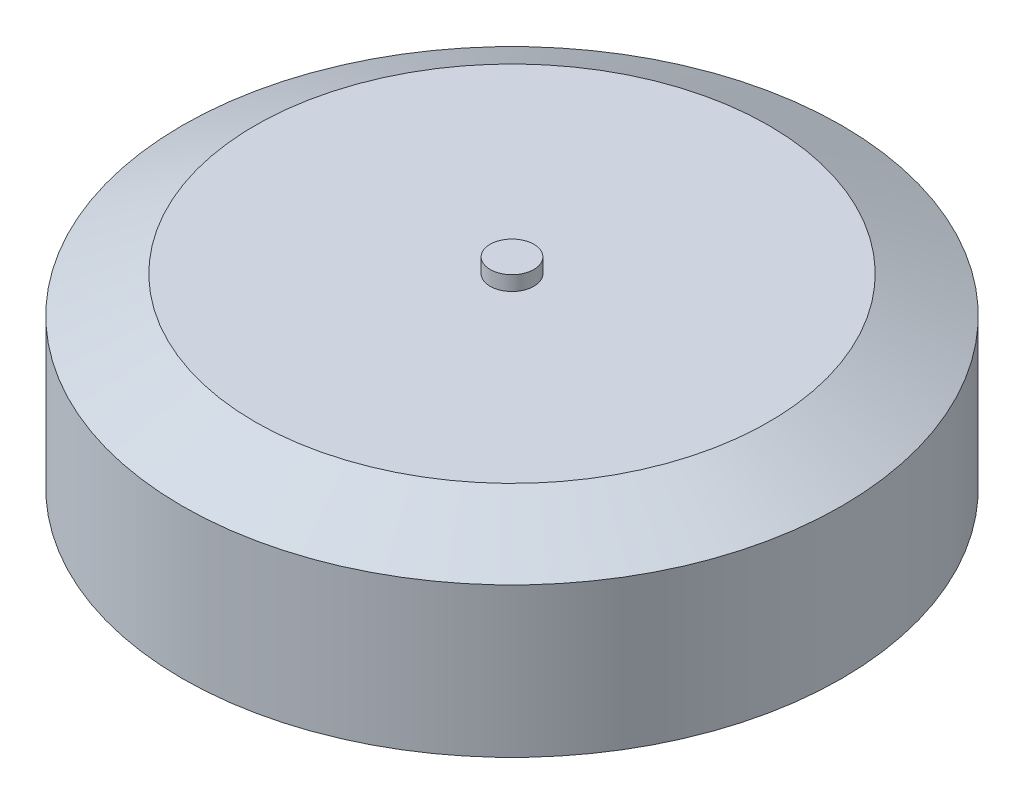
ISO-10303-21;
HEADER;
FILE_DESCRIPTION(('STEP AP214'),'2;1');
FILE_NAME('part.step','',(''),(''),'','','');
FILE_SCHEMA(('AUTOMOTIVE_DESIGN { 1 0 10303 214 1 1 1 1 }'));
ENDSEC;
DATA;
#1=APPLICATION_CONTEXT('core data for automotive mechanical design processes');
#2=APPLICATION_PROTOCOL_DEFINITION('international standard','automotive_design',2000,#1);
#3=PRODUCT_CONTEXT('',#1,'mechanical');
#4=PRODUCT('Part','Part','',(#3));
#5=PRODUCT_RELATED_PRODUCT_CATEGORY('part','',(#4));
#6=PRODUCT_DEFINITION_FORMATION('','',#4);
#7=PRODUCT_DEFINITION_CONTEXT('part definition',#1,'design');
#8=PRODUCT_DEFINITION('design','',#6,#7);
#9=PRODUCT_DEFINITION_SHAPE('','',#8);
#10=(LENGTH_UNIT() NAMED_UNIT(*) SI_UNIT(.MILLI.,.METRE.));
#11=(NAMED_UNIT(*) PLANE_ANGLE_UNIT() SI_UNIT($,.RADIAN.));
#12=(NAMED_UNIT(*) SI_UNIT($,.STERADIAN.) SOLID_ANGLE_UNIT());
#13=UNCERTAINTY_MEASURE_WITH_UNIT(LENGTH_MEASURE(1.E-05),#10,'distance_accuracy_value','');
#14=(GEOMETRIC_REPRESENTATION_CONTEXT(3) GLOBAL_UNCERTAINTY_ASSIGNED_CONTEXT((#13)) GLOBAL_UNIT_ASSIGNED_CONTEXT((#10,
#11,#12)) REPRESENTATION_CONTEXT('',''));
#15=CARTESIAN_POINT('',(0.,0.,0.));
#16=DIRECTION('',(0.,0.,1.));
#17=DIRECTION('',(1.,0.,0.));
#18=AXIS2_PLACEMENT_3D('',#15,#16,#17);
#19=CARTESIAN_POINT('',(0.,15.25,0.));
#20=DIRECTION('',(0.,-1.,0.));
#21=DIRECTION('',(0.,0.,-1.));
#22=AXIS2_PLACEMENT_3D('',#19,#20,#21);
#23=PLANE('',#22);
#24=CARTESIAN_POINT('',(0.,15.25,0.));
#25=DIRECTION('',(0.,-1.,0.));
#26=DIRECTION('',(0.,0.,-1.));
#27=AXIS2_PLACEMENT_3D('',#24,#25,#26);
#28=CIRCLE('',#27,3.);
#29=CARTESIAN_POINT('',(0.,15.25,-3.));
#30=VERTEX_POINT('',#29);
#31=EDGE_CURVE('E10',#30,#30,#28,.F.);
#32=ORIENTED_EDGE('',*,*,#31,.F.);
#33=EDGE_LOOP('',(#32));
#34=FACE_BOUND('',#33,.T.);
#35=CARTESIAN_POINT('',(0.,15.25,0.));
#36=DIRECTION('',(0.,-1.,0.));
#37=DIRECTION('',(0.,0.,-1.));
#38=AXIS2_PLACEMENT_3D('',#35,#36,#37);
#39=CIRCLE('',#38,35.25);
#40=CARTESIAN_POINT('',(0.,15.25,-35.25));
#41=VERTEX_POINT('',#40);
#42=EDGE_CURVE('E43',#41,#41,#39,.T.);
#43=ORIENTED_EDGE('',*,*,#42,.F.);
#44=EDGE_LOOP('',(#43));
#45=FACE_BOUND('',#44,.T.);
#46=ADVANCED_FACE('F37',(#34,#45),#23,.F.);
#47=CARTESIAN_POINT('',(0.,15.25,0.));
#48=DIRECTION('',(0.,-1.,0.));
#49=DIRECTION('',(0.,0.,-1.));
#50=AXIS2_PLACEMENT_3D('',#47,#48,#49);
#51=CONICAL_SURFACE('',#50,35.25,1.10714871779409);
#52=CARTESIAN_POINT('',(0.,10.25,0.));
#53=DIRECTION('',(0.,-1.,0.));
#54=DIRECTION('',(0.,0.,-1.));
#55=AXIS2_PLACEMENT_3D('',#52,#53,#54);
#56=CIRCLE('',#55,45.25);
#57=CARTESIAN_POINT('',(0.,10.25,-45.25));
#58=VERTEX_POINT('',#57);
#59=EDGE_CURVE('E47',#58,#58,#56,.T.);
#60=ORIENTED_EDGE('',*,*,#59,.F.);
#61=EDGE_LOOP('',(#60));
#62=FACE_BOUND('',#61,.T.);
#63=ORIENTED_EDGE('',*,*,#42,.T.);
#64=EDGE_LOOP('',(#63));
#65=FACE_BOUND('',#64,.T.);
#66=ADVANCED_FACE('F78',(#62,#65),#51,.T.);
#67=CARTESIAN_POINT('',(0.,-78.3816339571213,0.));
#68=DIRECTION('',(0.,-1.,0.));
#69=DIRECTION('',(0.,0.,-1.));
#70=AXIS2_PLACEMENT_3D('',#67,#68,#69);
#71=CYLINDRICAL_SURFACE('',#70,45.25);
#72=CARTESIAN_POINT('',(0.,-10.25,0.));
#73=DIRECTION('',(0.,-1.,0.));
#74=DIRECTION('',(0.,0.,-1.));
#75=AXIS2_PLACEMENT_3D('',#72,#73,#74);
#76=CIRCLE('',#75,45.25);
#77=CARTESIAN_POINT('',(0.,-10.25,-45.25));
#78=VERTEX_POINT('',#77);
#79=EDGE_CURVE('E51',#78,#78,#76,.T.);
#80=ORIENTED_EDGE('',*,*,#79,.F.);
#81=EDGE_LOOP('',(#80));
#82=FACE_BOUND('',#81,.T.);
#83=ORIENTED_EDGE('',*,*,#59,.T.);
#84=EDGE_LOOP('',(#83));
#85=FACE_BOUND('',#84,.T.);
#86=ADVANCED_FACE('F83',(#82,#85),#71,.T.);
#87=CARTESIAN_POINT('',(0.,-10.25,0.));
#88=DIRECTION('',(0.,1.,0.));
#89=DIRECTION('',(0.,0.,1.));
#90=AXIS2_PLACEMENT_3D('',#87,#88,#89);
#91=CONICAL_SURFACE('',#90,45.25,1.10714871779409);
#92=CARTESIAN_POINT('',(0.,-15.25,0.));
#93=DIRECTION('',(0.,-1.,0.));
#94=DIRECTION('',(0.,0.,-1.));
#95=AXIS2_PLACEMENT_3D('',#92,#93,#94);
#96=CIRCLE('',#95,35.25);
#97=CARTESIAN_POINT('',(0.,-15.25,-35.25));
#98=VERTEX_POINT('',#97);
#99=EDGE_CURVE('E56',#98,#98,#96,.T.);
#100=ORIENTED_EDGE('',*,*,#99,.F.);
#101=EDGE_LOOP('',(#100));
#102=FACE_BOUND('',#101,.T.);
#103=ORIENTED_EDGE('',*,*,#79,.T.);
#104=EDGE_LOOP('',(#103));
#105=FACE_BOUND('',#104,.T.);
#106=ADVANCED_FACE('F75',(#102,#105),#91,.T.);
#107=CARTESIAN_POINT('',(-35.25,-15.25,0.));
#108=DIRECTION('',(0.,1.,0.));
#109=DIRECTION('',(0.,0.,1.));
#110=AXIS2_PLACEMENT_3D('',#107,#108,#109);
#111=PLANE('',#110);
#112=ORIENTED_EDGE('',*,*,#99,.T.);
#113=EDGE_LOOP('',(#112));
#114=FACE_BOUND('',#113,.T.);
#115=ADVANCED_FACE('F67',(#114),#111,.F.);
#116=CARTESIAN_POINT('',(0.,17.25,0.));
#117=DIRECTION('',(0.,-1.,0.));
#118=DIRECTION('',(0.,0.,-1.));
#119=AXIS2_PLACEMENT_3D('',#116,#117,#118);
#120=CYLINDRICAL_SURFACE('',#119,3.);
#121=CARTESIAN_POINT('',(0.,17.25,0.));
#122=DIRECTION('',(0.,1.,0.));
#123=DIRECTION('',(0.,0.,1.));
#124=AXIS2_PLACEMENT_3D('',#121,#122,#123);
#125=CIRCLE('',#124,3.);
#126=CARTESIAN_POINT('',(0.,17.25,3.));
#127=VERTEX_POINT('',#126);
#128=EDGE_CURVE('E59',#127,#127,#125,.T.);
#129=ORIENTED_EDGE('',*,*,#128,.F.);
#130=EDGE_LOOP('',(#129));
#131=FACE_BOUND('',#130,.T.);
#132=ORIENTED_EDGE('',*,*,#31,.T.);
#133=EDGE_LOOP('',(#132));
#134=FACE_BOUND('',#133,.T.);
#135=ADVANCED_FACE('F65',(#131,#134),#120,.T.);
#136=CARTESIAN_POINT('',(0.,17.25,0.));
#137=DIRECTION('',(0.,1.,0.));
#138=DIRECTION('',(0.,0.,1.));
#139=AXIS2_PLACEMENT_3D('',#136,#137,#138);
#140=PLANE('',#139);
#141=ORIENTED_EDGE('',*,*,#128,.T.);
#142=EDGE_LOOP('',(#141));
#143=FACE_BOUND('',#142,.T.);
#144=ADVANCED_FACE('F63',(#143),#140,.T.);
#145=CLOSED_SHELL('',(#46,#66,#86,#106,#115,#135,#144));
#146=MANIFOLD_SOLID_BREP('B2',#145);
#147=ADVANCED_BREP_SHAPE_REPRESENTATION('',(#18,#146),#14);
#148=SHAPE_DEFINITION_REPRESENTATION(#9,#147);
ENDSEC;
END-ISO-10303-21;
